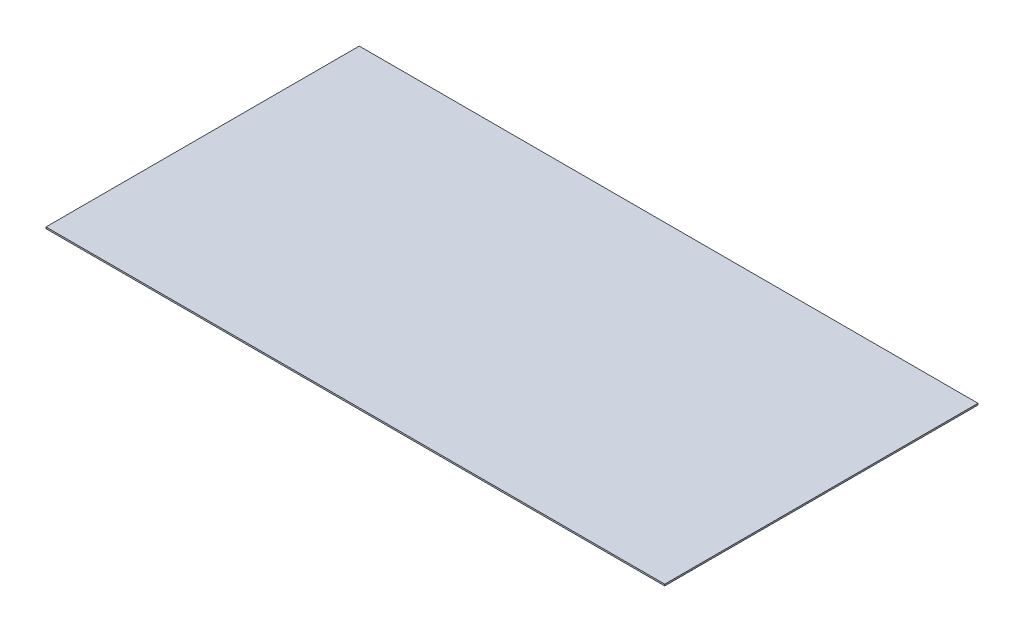
ISO-10303-21;
HEADER;
FILE_DESCRIPTION(('STEP AP214'),'2;1');
FILE_NAME('part.step','',(''),(''),'','','');
FILE_SCHEMA(('AUTOMOTIVE_DESIGN { 1 0 10303 214 1 1 1 1 }'));
ENDSEC;
DATA;
#1=APPLICATION_CONTEXT('core data for automotive mechanical design processes');
#2=APPLICATION_PROTOCOL_DEFINITION('international standard','automotive_design',2000,#1);
#3=PRODUCT_CONTEXT('',#1,'mechanical');
#4=PRODUCT('Part','Part','',(#3));
#5=PRODUCT_RELATED_PRODUCT_CATEGORY('part','',(#4));
#6=PRODUCT_DEFINITION_FORMATION('','',#4);
#7=PRODUCT_DEFINITION_CONTEXT('part definition',#1,'design');
#8=PRODUCT_DEFINITION('design','',#6,#7);
#9=PRODUCT_DEFINITION_SHAPE('','',#8);
#10=(LENGTH_UNIT() NAMED_UNIT(*) SI_UNIT(.MILLI.,.METRE.));
#11=(NAMED_UNIT(*) PLANE_ANGLE_UNIT() SI_UNIT($,.RADIAN.));
#12=(NAMED_UNIT(*) SI_UNIT($,.STERADIAN.) SOLID_ANGLE_UNIT());
#13=UNCERTAINTY_MEASURE_WITH_UNIT(LENGTH_MEASURE(1.E-05),#10,'distance_accuracy_value','');
#14=(GEOMETRIC_REPRESENTATION_CONTEXT(3) GLOBAL_UNCERTAINTY_ASSIGNED_CONTEXT((#13)) GLOBAL_UNIT_ASSIGNED_CONTEXT((#10,
#11,#12)) REPRESENTATION_CONTEXT('',''));
#15=CARTESIAN_POINT('',(0.,0.,0.));
#16=DIRECTION('',(0.,0.,1.));
#17=DIRECTION('',(1.,0.,0.));
#18=AXIS2_PLACEMENT_3D('',#15,#16,#17);
#19=CARTESIAN_POINT('',(0.,1.,-100.));
#20=DIRECTION('',(1.,0.,0.));
#21=DIRECTION('',(0.,0.,-1.));
#22=AXIS2_PLACEMENT_3D('',#19,#20,#21);
#23=PLANE('',#22);
#24=DIRECTION('',(0.,0.,1.));
#25=VECTOR('',#24,1.);
#26=CARTESIAN_POINT('',(0.,0.,-100.));
#27=LINE('',#26,#25);
#28=CARTESIAN_POINT('',(0.,0.,-100.));
#29=VERTEX_POINT('',#28);
#30=CARTESIAN_POINT('',(0.,0.,100.));
#31=VERTEX_POINT('',#30);
#32=EDGE_CURVE('E95',#29,#31,#27,.T.);
#33=ORIENTED_EDGE('',*,*,#32,.T.);
#34=DIRECTION('',(0.,-1.,0.));
#35=VECTOR('',#34,1.);
#36=CARTESIAN_POINT('',(0.,1.,100.));
#37=LINE('',#36,#35);
#38=CARTESIAN_POINT('',(0.,1.,100.));
#39=VERTEX_POINT('',#38);
#40=EDGE_CURVE('E11',#39,#31,#37,.T.);
#41=ORIENTED_EDGE('',*,*,#40,.F.);
#42=DIRECTION('',(0.,0.,1.));
#43=VECTOR('',#42,1.);
#44=CARTESIAN_POINT('',(0.,1.,-100.));
#45=LINE('',#44,#43);
#46=CARTESIAN_POINT('',(0.,1.,-100.));
#47=VERTEX_POINT('',#46);
#48=EDGE_CURVE('E83',#47,#39,#45,.T.);
#49=ORIENTED_EDGE('',*,*,#48,.F.);
#50=DIRECTION('',(0.,-1.,0.));
#51=VECTOR('',#50,1.);
#52=CARTESIAN_POINT('',(0.,1.,-100.));
#53=LINE('',#52,#51);
#54=EDGE_CURVE('E91',#47,#29,#53,.T.);
#55=ORIENTED_EDGE('',*,*,#54,.T.);
#56=EDGE_LOOP('',(#33,#41,#49,#55));
#57=FACE_BOUND('',#56,.T.);
#58=ADVANCED_FACE('F32',(#57),#23,.F.);
#59=CARTESIAN_POINT('',(0.,1.,100.));
#60=DIRECTION('',(0.,0.,-1.));
#61=DIRECTION('',(-1.,0.,0.));
#62=AXIS2_PLACEMENT_3D('',#59,#60,#61);
#63=PLANE('',#62);
#64=DIRECTION('',(1.,0.,0.));
#65=VECTOR('',#64,1.);
#66=CARTESIAN_POINT('',(0.,0.,100.));
#67=LINE('',#66,#65);
#68=CARTESIAN_POINT('',(395.,0.,100.));
#69=VERTEX_POINT('',#68);
#70=EDGE_CURVE('E87',#31,#69,#67,.T.);
#71=ORIENTED_EDGE('',*,*,#70,.T.);
#72=DIRECTION('',(0.,-1.,0.));
#73=VECTOR('',#72,1.);
#74=CARTESIAN_POINT('',(395.,1.,100.));
#75=LINE('',#74,#73);
#76=CARTESIAN_POINT('',(395.,1.,100.));
#77=VERTEX_POINT('',#76);
#78=EDGE_CURVE('E40',#77,#69,#75,.T.);
#79=ORIENTED_EDGE('',*,*,#78,.F.);
#80=DIRECTION('',(1.,0.,0.));
#81=VECTOR('',#80,1.);
#82=CARTESIAN_POINT('',(0.,1.,100.));
#83=LINE('',#82,#81);
#84=EDGE_CURVE('E78',#39,#77,#83,.T.);
#85=ORIENTED_EDGE('',*,*,#84,.F.);
#86=ORIENTED_EDGE('',*,*,#40,.T.);
#87=EDGE_LOOP('',(#71,#79,#85,#86));
#88=FACE_BOUND('',#87,.T.);
#89=ADVANCED_FACE('F86',(#88),#63,.F.);
#90=CARTESIAN_POINT('',(395.,1.,-100.));
#91=DIRECTION('',(-1.,0.,0.));
#92=DIRECTION('',(0.,0.,1.));
#93=AXIS2_PLACEMENT_3D('',#90,#91,#92);
#94=PLANE('',#93);
#95=DIRECTION('',(0.,0.,-1.));
#96=VECTOR('',#95,1.);
#97=CARTESIAN_POINT('',(395.,0.,-100.));
#98=LINE('',#97,#96);
#99=CARTESIAN_POINT('',(395.,0.,-100.));
#100=VERTEX_POINT('',#99);
#101=EDGE_CURVE('E65',#69,#100,#98,.T.);
#102=ORIENTED_EDGE('',*,*,#101,.T.);
#103=DIRECTION('',(0.,-1.,0.));
#104=VECTOR('',#103,1.);
#105=CARTESIAN_POINT('',(395.,1.,-100.));
#106=LINE('',#105,#104);
#107=CARTESIAN_POINT('',(395.,1.,-100.));
#108=VERTEX_POINT('',#107);
#109=EDGE_CURVE('E88',#108,#100,#106,.T.);
#110=ORIENTED_EDGE('',*,*,#109,.F.);
#111=DIRECTION('',(0.,0.,-1.));
#112=VECTOR('',#111,1.);
#113=CARTESIAN_POINT('',(395.,1.,-100.));
#114=LINE('',#113,#112);
#115=EDGE_CURVE('E81',#77,#108,#114,.T.);
#116=ORIENTED_EDGE('',*,*,#115,.F.);
#117=ORIENTED_EDGE('',*,*,#78,.T.);
#118=EDGE_LOOP('',(#102,#110,#116,#117));
#119=FACE_BOUND('',#118,.T.);
#120=ADVANCED_FACE('F89',(#119),#94,.F.);
#121=CARTESIAN_POINT('',(0.,1.,-100.));
#122=DIRECTION('',(0.,0.,1.));
#123=DIRECTION('',(1.,0.,0.));
#124=AXIS2_PLACEMENT_3D('',#121,#122,#123);
#125=PLANE('',#124);
#126=DIRECTION('',(-1.,0.,0.));
#127=VECTOR('',#126,1.);
#128=CARTESIAN_POINT('',(0.,0.,-100.));
#129=LINE('',#128,#127);
#130=EDGE_CURVE('E71',#100,#29,#129,.T.);
#131=ORIENTED_EDGE('',*,*,#130,.T.);
#132=ORIENTED_EDGE('',*,*,#54,.F.);
#133=DIRECTION('',(-1.,0.,0.));
#134=VECTOR('',#133,1.);
#135=CARTESIAN_POINT('',(0.,1.,-100.));
#136=LINE('',#135,#134);
#137=EDGE_CURVE('E48',#108,#47,#136,.T.);
#138=ORIENTED_EDGE('',*,*,#137,.F.);
#139=ORIENTED_EDGE('',*,*,#109,.T.);
#140=EDGE_LOOP('',(#131,#132,#138,#139));
#141=FACE_BOUND('',#140,.T.);
#142=ADVANCED_FACE('F102',(#141),#125,.F.);
#143=CARTESIAN_POINT('',(0.,1.,100.));
#144=DIRECTION('',(0.,1.,0.));
#145=DIRECTION('',(0.,0.,1.));
#146=AXIS2_PLACEMENT_3D('',#143,#144,#145);
#147=PLANE('',#146);
#148=ORIENTED_EDGE('',*,*,#48,.T.);
#149=ORIENTED_EDGE('',*,*,#84,.T.);
#150=ORIENTED_EDGE('',*,*,#115,.T.);
#151=ORIENTED_EDGE('',*,*,#137,.T.);
#152=EDGE_LOOP('',(#148,#149,#150,#151));
#153=FACE_BOUND('',#152,.T.);
#154=ADVANCED_FACE('F79',(#153),#147,.T.);
#155=CARTESIAN_POINT('',(0.,0.,100.));
#156=DIRECTION('',(0.,1.,0.));
#157=DIRECTION('',(0.,0.,1.));
#158=AXIS2_PLACEMENT_3D('',#155,#156,#157);
#159=PLANE('',#158);
#160=ORIENTED_EDGE('',*,*,#32,.F.);
#161=ORIENTED_EDGE('',*,*,#130,.F.);
#162=ORIENTED_EDGE('',*,*,#101,.F.);
#163=ORIENTED_EDGE('',*,*,#70,.F.);
#164=EDGE_LOOP('',(#160,#161,#162,#163));
#165=FACE_BOUND('',#164,.T.);
#166=ADVANCED_FACE('F105',(#165),#159,.F.);
#167=CLOSED_SHELL('',(#58,#89,#120,#142,#154,#166));
#168=MANIFOLD_SOLID_BREP('B2',#167);
#169=ADVANCED_BREP_SHAPE_REPRESENTATION('',(#18,#168),#14);
#170=SHAPE_DEFINITION_REPRESENTATION(#9,#169);
ENDSEC;
END-ISO-10303-21;
